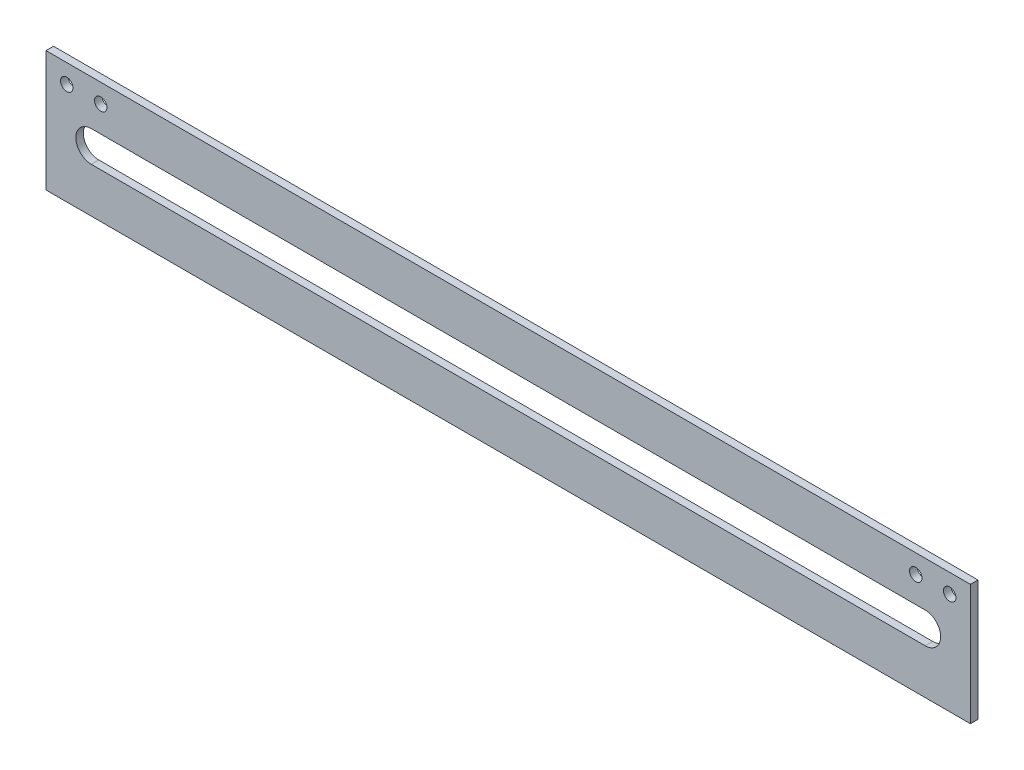
ISO-10303-21;
HEADER;
FILE_DESCRIPTION(('STEP AP214'),'2;1');
FILE_NAME('part.step','',(''),(''),'','','');
FILE_SCHEMA(('AUTOMOTIVE_DESIGN { 1 0 10303 214 1 1 1 1 }'));
ENDSEC;
DATA;
#1=APPLICATION_CONTEXT('core data for automotive mechanical design processes');
#2=APPLICATION_PROTOCOL_DEFINITION('international standard','automotive_design',2000,#1);
#3=PRODUCT_CONTEXT('',#1,'mechanical');
#4=PRODUCT('Part','Part','',(#3));
#5=PRODUCT_RELATED_PRODUCT_CATEGORY('part','',(#4));
#6=PRODUCT_DEFINITION_FORMATION('','',#4);
#7=PRODUCT_DEFINITION_CONTEXT('part definition',#1,'design');
#8=PRODUCT_DEFINITION('design','',#6,#7);
#9=PRODUCT_DEFINITION_SHAPE('','',#8);
#10=(LENGTH_UNIT() NAMED_UNIT(*) SI_UNIT(.MILLI.,.METRE.));
#11=(NAMED_UNIT(*) PLANE_ANGLE_UNIT() SI_UNIT($,.RADIAN.));
#12=(NAMED_UNIT(*) SI_UNIT($,.STERADIAN.) SOLID_ANGLE_UNIT());
#13=UNCERTAINTY_MEASURE_WITH_UNIT(LENGTH_MEASURE(1.E-05),#10,'distance_accuracy_value','');
#14=(GEOMETRIC_REPRESENTATION_CONTEXT(3) GLOBAL_UNCERTAINTY_ASSIGNED_CONTEXT((#13)) GLOBAL_UNIT_ASSIGNED_CONTEXT((#10,
#11,#12)) REPRESENTATION_CONTEXT('',''));
#15=CARTESIAN_POINT('',(0.,0.,0.));
#16=DIRECTION('',(0.,0.,1.));
#17=DIRECTION('',(1.,0.,0.));
#18=AXIS2_PLACEMENT_3D('',#15,#16,#17);
#19=CARTESIAN_POINT('',(0.,0.,2.));
#20=DIRECTION('',(0.,1.,0.));
#21=DIRECTION('',(-1.,0.,0.));
#22=AXIS2_PLACEMENT_3D('',#19,#20,#21);
#23=PLANE('',#22);
#24=DIRECTION('',(1.,0.,0.));
#25=VECTOR('',#24,1.);
#26=CARTESIAN_POINT('',(0.,0.,0.));
#27=LINE('',#26,#25);
#28=CARTESIAN_POINT('',(0.,0.,0.));
#29=VERTEX_POINT('',#28);
#30=CARTESIAN_POINT('',(245.,0.,0.));
#31=VERTEX_POINT('',#30);
#32=EDGE_CURVE('E157',#29,#31,#27,.T.);
#33=ORIENTED_EDGE('',*,*,#32,.T.);
#34=DIRECTION('',(0.,0.,-1.));
#35=VECTOR('',#34,1.);
#36=CARTESIAN_POINT('',(245.,0.,2.));
#37=LINE('',#36,#35);
#38=CARTESIAN_POINT('',(245.,0.,2.));
#39=VERTEX_POINT('',#38);
#40=EDGE_CURVE('E11',#39,#31,#37,.T.);
#41=ORIENTED_EDGE('',*,*,#40,.F.);
#42=DIRECTION('',(1.,0.,0.));
#43=VECTOR('',#42,1.);
#44=CARTESIAN_POINT('',(0.,0.,2.));
#45=LINE('',#44,#43);
#46=CARTESIAN_POINT('',(0.,0.,2.));
#47=VERTEX_POINT('',#46);
#48=EDGE_CURVE('E116',#47,#39,#45,.T.);
#49=ORIENTED_EDGE('',*,*,#48,.F.);
#50=DIRECTION('',(0.,0.,-1.));
#51=VECTOR('',#50,1.);
#52=CARTESIAN_POINT('',(0.,0.,2.));
#53=LINE('',#52,#51);
#54=EDGE_CURVE('E55',#47,#29,#53,.T.);
#55=ORIENTED_EDGE('',*,*,#54,.T.);
#56=EDGE_LOOP('',(#33,#41,#49,#55));
#57=FACE_BOUND('',#56,.T.);
#58=ADVANCED_FACE('F36',(#57),#23,.F.);
#59=CARTESIAN_POINT('',(245.,0.,2.));
#60=DIRECTION('',(-1.,0.,0.));
#61=DIRECTION('',(0.,0.,1.));
#62=AXIS2_PLACEMENT_3D('',#59,#60,#61);
#63=PLANE('',#62);
#64=DIRECTION('',(0.,1.,0.));
#65=VECTOR('',#64,1.);
#66=CARTESIAN_POINT('',(245.,0.,0.));
#67=LINE('',#66,#65);
#68=CARTESIAN_POINT('',(245.,32.,0.));
#69=VERTEX_POINT('',#68);
#70=EDGE_CURVE('E122',#31,#69,#67,.T.);
#71=ORIENTED_EDGE('',*,*,#70,.T.);
#72=DIRECTION('',(0.,0.,-1.));
#73=VECTOR('',#72,1.);
#74=CARTESIAN_POINT('',(245.,32.,2.));
#75=LINE('',#74,#73);
#76=CARTESIAN_POINT('',(245.,32.,2.));
#77=VERTEX_POINT('',#76);
#78=EDGE_CURVE('E46',#77,#69,#75,.T.);
#79=ORIENTED_EDGE('',*,*,#78,.F.);
#80=DIRECTION('',(0.,1.,0.));
#81=VECTOR('',#80,1.);
#82=CARTESIAN_POINT('',(245.,0.,2.));
#83=LINE('',#82,#81);
#84=EDGE_CURVE('E109',#39,#77,#83,.T.);
#85=ORIENTED_EDGE('',*,*,#84,.F.);
#86=ORIENTED_EDGE('',*,*,#40,.T.);
#87=EDGE_LOOP('',(#71,#79,#85,#86));
#88=FACE_BOUND('',#87,.T.);
#89=ADVANCED_FACE('F121',(#88),#63,.F.);
#90=CARTESIAN_POINT('',(0.,32.,2.));
#91=DIRECTION('',(0.,1.,0.));
#92=DIRECTION('',(0.,0.,1.));
#93=AXIS2_PLACEMENT_3D('',#90,#91,#92);
#94=PLANE('',#93);
#95=DIRECTION('',(1.,0.,0.));
#96=VECTOR('',#95,1.);
#97=CARTESIAN_POINT('',(0.,32.,0.));
#98=LINE('',#97,#96);
#99=CARTESIAN_POINT('',(0.,32.,0.));
#100=VERTEX_POINT('',#99);
#101=EDGE_CURVE('E160',#100,#69,#98,.T.);
#102=ORIENTED_EDGE('',*,*,#101,.F.);
#103=DIRECTION('',(0.,0.,-1.));
#104=VECTOR('',#103,1.);
#105=CARTESIAN_POINT('',(0.,32.,2.));
#106=LINE('',#105,#104);
#107=CARTESIAN_POINT('',(0.,32.,2.));
#108=VERTEX_POINT('',#107);
#109=EDGE_CURVE('E81',#108,#100,#106,.T.);
#110=ORIENTED_EDGE('',*,*,#109,.F.);
#111=DIRECTION('',(1.,0.,0.));
#112=VECTOR('',#111,1.);
#113=CARTESIAN_POINT('',(0.,32.,2.));
#114=LINE('',#113,#112);
#115=EDGE_CURVE('E115',#108,#77,#114,.T.);
#116=ORIENTED_EDGE('',*,*,#115,.T.);
#117=ORIENTED_EDGE('',*,*,#78,.T.);
#118=EDGE_LOOP('',(#102,#110,#116,#117));
#119=FACE_BOUND('',#118,.T.);
#120=ADVANCED_FACE('F126',(#119),#94,.T.);
#121=CARTESIAN_POINT('',(233.,16.,2.));
#122=DIRECTION('',(0.,0.,-1.));
#123=DIRECTION('',(-1.,0.,0.));
#124=AXIS2_PLACEMENT_3D('',#121,#122,#123);
#125=CYLINDRICAL_SURFACE('',#124,4.1);
#126=CARTESIAN_POINT('',(233.,16.,0.));
#127=DIRECTION('',(0.,0.,1.));
#128=DIRECTION('',(1.,0.,0.));
#129=AXIS2_PLACEMENT_3D('',#126,#127,#128);
#130=CIRCLE('',#129,4.1);
#131=CARTESIAN_POINT('',(233.,11.9,0.));
#132=VERTEX_POINT('',#131);
#133=CARTESIAN_POINT('',(233.,20.1,0.));
#134=VERTEX_POINT('',#133);
#135=EDGE_CURVE('E145',#132,#134,#130,.T.);
#136=ORIENTED_EDGE('',*,*,#135,.F.);
#137=DIRECTION('',(0.,0.,-1.));
#138=VECTOR('',#137,1.);
#139=CARTESIAN_POINT('',(233.,11.9,2.));
#140=LINE('',#139,#138);
#141=CARTESIAN_POINT('',(233.,11.9,2.));
#142=VERTEX_POINT('',#141);
#143=EDGE_CURVE('E40',#142,#132,#140,.T.);
#144=ORIENTED_EDGE('',*,*,#143,.F.);
#145=CARTESIAN_POINT('',(233.,16.,2.));
#146=DIRECTION('',(0.,0.,1.));
#147=DIRECTION('',(1.,0.,0.));
#148=AXIS2_PLACEMENT_3D('',#145,#146,#147);
#149=CIRCLE('',#148,4.1);
#150=CARTESIAN_POINT('',(233.,20.1,2.));
#151=VERTEX_POINT('',#150);
#152=EDGE_CURVE('E199',#142,#151,#149,.T.);
#153=ORIENTED_EDGE('',*,*,#152,.T.);
#154=DIRECTION('',(0.,0.,-1.));
#155=VECTOR('',#154,1.);
#156=CARTESIAN_POINT('',(233.,20.1,2.));
#157=LINE('',#156,#155);
#158=EDGE_CURVE('E135',#151,#134,#157,.T.);
#159=ORIENTED_EDGE('',*,*,#158,.T.);
#160=EDGE_LOOP('',(#136,#144,#153,#159));
#161=FACE_BOUND('',#160,.T.);
#162=ADVANCED_FACE('F183',(#161),#125,.F.);
#163=CARTESIAN_POINT('',(0.,11.9,2.));
#164=DIRECTION('',(0.,1.,0.));
#165=DIRECTION('',(0.,0.,1.));
#166=AXIS2_PLACEMENT_3D('',#163,#164,#165);
#167=PLANE('',#166);
#168=DIRECTION('',(1.,0.,0.));
#169=VECTOR('',#168,1.);
#170=CARTESIAN_POINT('',(0.,11.9,0.));
#171=LINE('',#170,#169);
#172=CARTESIAN_POINT('',(12.,11.9,0.));
#173=VERTEX_POINT('',#172);
#174=EDGE_CURVE('E148',#173,#132,#171,.T.);
#175=ORIENTED_EDGE('',*,*,#174,.F.);
#176=DIRECTION('',(0.,0.,-1.));
#177=VECTOR('',#176,1.);
#178=CARTESIAN_POINT('',(12.,11.9,2.));
#179=LINE('',#178,#177);
#180=CARTESIAN_POINT('',(12.,11.9,2.));
#181=VERTEX_POINT('',#180);
#182=EDGE_CURVE('E173',#181,#173,#179,.T.);
#183=ORIENTED_EDGE('',*,*,#182,.F.);
#184=DIRECTION('',(1.,0.,0.));
#185=VECTOR('',#184,1.);
#186=CARTESIAN_POINT('',(0.,11.9,2.));
#187=LINE('',#186,#185);
#188=EDGE_CURVE('E182',#181,#142,#187,.T.);
#189=ORIENTED_EDGE('',*,*,#188,.T.);
#190=ORIENTED_EDGE('',*,*,#143,.T.);
#191=EDGE_LOOP('',(#175,#183,#189,#190));
#192=FACE_BOUND('',#191,.T.);
#193=ADVANCED_FACE('F180',(#192),#167,.T.);
#194=CARTESIAN_POINT('',(12.,16.,2.));
#195=DIRECTION('',(0.,0.,-1.));
#196=DIRECTION('',(-1.,0.,0.));
#197=AXIS2_PLACEMENT_3D('',#194,#195,#196);
#198=CYLINDRICAL_SURFACE('',#197,4.1);
#199=CARTESIAN_POINT('',(12.,16.,0.));
#200=DIRECTION('',(0.,0.,1.));
#201=DIRECTION('',(1.,0.,0.));
#202=AXIS2_PLACEMENT_3D('',#199,#200,#201);
#203=CIRCLE('',#202,4.1);
#204=CARTESIAN_POINT('',(12.,20.1,0.));
#205=VERTEX_POINT('',#204);
#206=EDGE_CURVE('E151',#205,#173,#203,.T.);
#207=ORIENTED_EDGE('',*,*,#206,.F.);
#208=DIRECTION('',(0.,0.,-1.));
#209=VECTOR('',#208,1.);
#210=CARTESIAN_POINT('',(12.,20.1,2.));
#211=LINE('',#210,#209);
#212=CARTESIAN_POINT('',(12.,20.1,2.));
#213=VERTEX_POINT('',#212);
#214=EDGE_CURVE('E172',#213,#205,#211,.T.);
#215=ORIENTED_EDGE('',*,*,#214,.F.);
#216=CARTESIAN_POINT('',(12.,16.,2.));
#217=DIRECTION('',(0.,0.,1.));
#218=DIRECTION('',(1.,0.,0.));
#219=AXIS2_PLACEMENT_3D('',#216,#217,#218);
#220=CIRCLE('',#219,4.1);
#221=EDGE_CURVE('E192',#213,#181,#220,.T.);
#222=ORIENTED_EDGE('',*,*,#221,.T.);
#223=ORIENTED_EDGE('',*,*,#182,.T.);
#224=EDGE_LOOP('',(#207,#215,#222,#223));
#225=FACE_BOUND('',#224,.T.);
#226=ADVANCED_FACE('F189',(#225),#198,.F.);
#227=CARTESIAN_POINT('',(0.,0.,2.));
#228=DIRECTION('',(-1.,0.,0.));
#229=DIRECTION('',(0.,0.,1.));
#230=AXIS2_PLACEMENT_3D('',#227,#228,#229);
#231=PLANE('',#230);
#232=DIRECTION('',(0.,1.,0.));
#233=VECTOR('',#232,1.);
#234=CARTESIAN_POINT('',(0.,0.,0.));
#235=LINE('',#234,#233);
#236=EDGE_CURVE('E162',#29,#100,#235,.T.);
#237=ORIENTED_EDGE('',*,*,#236,.F.);
#238=ORIENTED_EDGE('',*,*,#54,.F.);
#239=DIRECTION('',(0.,1.,0.));
#240=VECTOR('',#239,1.);
#241=CARTESIAN_POINT('',(0.,0.,2.));
#242=LINE('',#241,#240);
#243=EDGE_CURVE('E127',#47,#108,#242,.T.);
#244=ORIENTED_EDGE('',*,*,#243,.T.);
#245=ORIENTED_EDGE('',*,*,#109,.T.);
#246=EDGE_LOOP('',(#237,#238,#244,#245));
#247=FACE_BOUND('',#246,.T.);
#248=ADVANCED_FACE('F236',(#247),#231,.T.);
#249=CARTESIAN_POINT('',(0.,20.1,2.));
#250=DIRECTION('',(0.,1.,0.));
#251=DIRECTION('',(0.,0.,1.));
#252=AXIS2_PLACEMENT_3D('',#249,#250,#251);
#253=PLANE('',#252);
#254=DIRECTION('',(1.,0.,0.));
#255=VECTOR('',#254,1.);
#256=CARTESIAN_POINT('',(0.,20.1,0.));
#257=LINE('',#256,#255);
#258=EDGE_CURVE('E154',#205,#134,#257,.T.);
#259=ORIENTED_EDGE('',*,*,#258,.T.);
#260=ORIENTED_EDGE('',*,*,#158,.F.);
#261=DIRECTION('',(1.,0.,0.));
#262=VECTOR('',#261,1.);
#263=CARTESIAN_POINT('',(0.,20.1,2.));
#264=LINE('',#263,#262);
#265=EDGE_CURVE('E194',#213,#151,#264,.T.);
#266=ORIENTED_EDGE('',*,*,#265,.F.);
#267=ORIENTED_EDGE('',*,*,#214,.T.);
#268=EDGE_LOOP('',(#259,#260,#266,#267));
#269=FACE_BOUND('',#268,.T.);
#270=ADVANCED_FACE('F195',(#269),#253,.F.);
#271=CARTESIAN_POINT('',(14.5,27.,2.));
#272=DIRECTION('',(0.,0.,-1.));
#273=DIRECTION('',(-1.,0.,0.));
#274=AXIS2_PLACEMENT_3D('',#271,#272,#273);
#275=CYLINDRICAL_SURFACE('',#274,1.65);
#276=CARTESIAN_POINT('',(14.5,27.,2.));
#277=DIRECTION('',(0.,0.,1.));
#278=DIRECTION('',(1.,0.,0.));
#279=AXIS2_PLACEMENT_3D('',#276,#277,#278);
#280=CIRCLE('',#279,1.65);
#281=CARTESIAN_POINT('',(16.15,27.,2.));
#282=VERTEX_POINT('',#281);
#283=EDGE_CURVE('E203',#282,#282,#280,.T.);
#284=ORIENTED_EDGE('',*,*,#283,.T.);
#285=EDGE_LOOP('',(#284));
#286=FACE_BOUND('',#285,.T.);
#287=CARTESIAN_POINT('',(14.5,27.,0.));
#288=DIRECTION('',(0.,0.,1.));
#289=DIRECTION('',(1.,0.,0.));
#290=AXIS2_PLACEMENT_3D('',#287,#288,#289);
#291=CIRCLE('',#290,1.65);
#292=CARTESIAN_POINT('',(16.15,27.,0.));
#293=VERTEX_POINT('',#292);
#294=EDGE_CURVE('E142',#293,#293,#291,.T.);
#295=ORIENTED_EDGE('',*,*,#294,.F.);
#296=EDGE_LOOP('',(#295));
#297=FACE_BOUND('',#296,.T.);
#298=ADVANCED_FACE('F227',(#286,#297),#275,.F.);
#299=CARTESIAN_POINT('',(5.5,27.,2.));
#300=DIRECTION('',(0.,0.,-1.));
#301=DIRECTION('',(-1.,0.,0.));
#302=AXIS2_PLACEMENT_3D('',#299,#300,#301);
#303=CYLINDRICAL_SURFACE('',#302,1.65);
#304=CARTESIAN_POINT('',(5.5,27.,2.));
#305=DIRECTION('',(0.,0.,1.));
#306=DIRECTION('',(1.,0.,0.));
#307=AXIS2_PLACEMENT_3D('',#304,#305,#306);
#308=CIRCLE('',#307,1.65);
#309=CARTESIAN_POINT('',(7.15,27.,2.));
#310=VERTEX_POINT('',#309);
#311=EDGE_CURVE('E206',#310,#310,#308,.T.);
#312=ORIENTED_EDGE('',*,*,#311,.T.);
#313=EDGE_LOOP('',(#312));
#314=FACE_BOUND('',#313,.T.);
#315=CARTESIAN_POINT('',(5.5,27.,0.));
#316=DIRECTION('',(0.,0.,1.));
#317=DIRECTION('',(1.,0.,0.));
#318=AXIS2_PLACEMENT_3D('',#315,#316,#317);
#319=CIRCLE('',#318,1.65);
#320=CARTESIAN_POINT('',(7.15,27.,0.));
#321=VERTEX_POINT('',#320);
#322=EDGE_CURVE('E139',#321,#321,#319,.T.);
#323=ORIENTED_EDGE('',*,*,#322,.F.);
#324=EDGE_LOOP('',(#323));
#325=FACE_BOUND('',#324,.T.);
#326=ADVANCED_FACE('F217',(#314,#325),#303,.F.);
#327=CARTESIAN_POINT('',(230.5,27.,2.));
#328=DIRECTION('',(0.,0.,-1.));
#329=DIRECTION('',(-1.,0.,0.));
#330=AXIS2_PLACEMENT_3D('',#327,#328,#329);
#331=CYLINDRICAL_SURFACE('',#330,1.65000000000002);
#332=CARTESIAN_POINT('',(230.5,27.,2.));
#333=DIRECTION('',(0.,0.,1.));
#334=DIRECTION('',(1.,0.,0.));
#335=AXIS2_PLACEMENT_3D('',#332,#333,#334);
#336=CIRCLE('',#335,1.65000000000002);
#337=CARTESIAN_POINT('',(232.15,27.,2.));
#338=VERTEX_POINT('',#337);
#339=EDGE_CURVE('E168',#338,#338,#336,.F.);
#340=ORIENTED_EDGE('',*,*,#339,.F.);
#341=EDGE_LOOP('',(#340));
#342=FACE_BOUND('',#341,.T.);
#343=CARTESIAN_POINT('',(230.5,27.,0.));
#344=DIRECTION('',(0.,0.,1.));
#345=DIRECTION('',(1.,0.,0.));
#346=AXIS2_PLACEMENT_3D('',#343,#344,#345);
#347=CIRCLE('',#346,1.65000000000002);
#348=CARTESIAN_POINT('',(232.15,27.,0.));
#349=VERTEX_POINT('',#348);
#350=EDGE_CURVE('E136',#349,#349,#347,.F.);
#351=ORIENTED_EDGE('',*,*,#350,.T.);
#352=EDGE_LOOP('',(#351));
#353=FACE_BOUND('',#352,.T.);
#354=ADVANCED_FACE('F38',(#342,#353),#331,.F.);
#355=CARTESIAN_POINT('',(239.5,27.,2.));
#356=DIRECTION('',(0.,0.,-1.));
#357=DIRECTION('',(-1.,0.,0.));
#358=AXIS2_PLACEMENT_3D('',#355,#356,#357);
#359=CYLINDRICAL_SURFACE('',#358,1.64999999999999);
#360=CARTESIAN_POINT('',(239.5,27.,2.));
#361=DIRECTION('',(0.,0.,1.));
#362=DIRECTION('',(1.,0.,0.));
#363=AXIS2_PLACEMENT_3D('',#360,#361,#362);
#364=CIRCLE('',#363,1.64999999999999);
#365=CARTESIAN_POINT('',(241.15,27.,2.));
#366=VERTEX_POINT('',#365);
#367=EDGE_CURVE('E129',#366,#366,#364,.F.);
#368=ORIENTED_EDGE('',*,*,#367,.F.);
#369=EDGE_LOOP('',(#368));
#370=FACE_BOUND('',#369,.T.);
#371=CARTESIAN_POINT('',(239.5,27.,0.));
#372=DIRECTION('',(0.,0.,1.));
#373=DIRECTION('',(1.,0.,0.));
#374=AXIS2_PLACEMENT_3D('',#371,#372,#373);
#375=CIRCLE('',#374,1.64999999999999);
#376=CARTESIAN_POINT('',(241.15,27.,0.));
#377=VERTEX_POINT('',#376);
#378=EDGE_CURVE('E165',#377,#377,#375,.F.);
#379=ORIENTED_EDGE('',*,*,#378,.T.);
#380=EDGE_LOOP('',(#379));
#381=FACE_BOUND('',#380,.T.);
#382=ADVANCED_FACE('F216',(#370,#381),#359,.F.);
#383=CARTESIAN_POINT('',(0.,0.,2.));
#384=DIRECTION('',(0.,0.,1.));
#385=DIRECTION('',(1.,0.,0.));
#386=AXIS2_PLACEMENT_3D('',#383,#384,#385);
#387=PLANE('',#386);
#388=ORIENTED_EDGE('',*,*,#339,.T.);
#389=EDGE_LOOP('',(#388));
#390=FACE_BOUND('',#389,.T.);
#391=ORIENTED_EDGE('',*,*,#311,.F.);
#392=EDGE_LOOP('',(#391));
#393=FACE_BOUND('',#392,.T.);
#394=ORIENTED_EDGE('',*,*,#283,.F.);
#395=EDGE_LOOP('',(#394));
#396=FACE_BOUND('',#395,.T.);
#397=ORIENTED_EDGE('',*,*,#152,.F.);
#398=ORIENTED_EDGE('',*,*,#188,.F.);
#399=ORIENTED_EDGE('',*,*,#221,.F.);
#400=ORIENTED_EDGE('',*,*,#265,.T.);
#401=EDGE_LOOP('',(#397,#398,#399,#400));
#402=FACE_BOUND('',#401,.T.);
#403=ORIENTED_EDGE('',*,*,#48,.T.);
#404=ORIENTED_EDGE('',*,*,#84,.T.);
#405=ORIENTED_EDGE('',*,*,#115,.F.);
#406=ORIENTED_EDGE('',*,*,#243,.F.);
#407=EDGE_LOOP('',(#403,#404,#405,#406));
#408=FACE_BOUND('',#407,.T.);
#409=ORIENTED_EDGE('',*,*,#367,.T.);
#410=EDGE_LOOP('',(#409));
#411=FACE_BOUND('',#410,.T.);
#412=ADVANCED_FACE('F111',(#390,#393,#396,#402,#408,#411),#387,.T.);
#413=CARTESIAN_POINT('',(0.,0.,0.));
#414=DIRECTION('',(0.,0.,1.));
#415=DIRECTION('',(1.,0.,0.));
#416=AXIS2_PLACEMENT_3D('',#413,#414,#415);
#417=PLANE('',#416);
#418=ORIENTED_EDGE('',*,*,#350,.F.);
#419=EDGE_LOOP('',(#418));
#420=FACE_BOUND('',#419,.T.);
#421=ORIENTED_EDGE('',*,*,#322,.T.);
#422=EDGE_LOOP('',(#421));
#423=FACE_BOUND('',#422,.T.);
#424=ORIENTED_EDGE('',*,*,#294,.T.);
#425=EDGE_LOOP('',(#424));
#426=FACE_BOUND('',#425,.T.);
#427=ORIENTED_EDGE('',*,*,#135,.T.);
#428=ORIENTED_EDGE('',*,*,#258,.F.);
#429=ORIENTED_EDGE('',*,*,#206,.T.);
#430=ORIENTED_EDGE('',*,*,#174,.T.);
#431=EDGE_LOOP('',(#427,#428,#429,#430));
#432=FACE_BOUND('',#431,.T.);
#433=ORIENTED_EDGE('',*,*,#32,.F.);
#434=ORIENTED_EDGE('',*,*,#236,.T.);
#435=ORIENTED_EDGE('',*,*,#101,.T.);
#436=ORIENTED_EDGE('',*,*,#70,.F.);
#437=EDGE_LOOP('',(#433,#434,#435,#436));
#438=FACE_BOUND('',#437,.T.);
#439=ORIENTED_EDGE('',*,*,#378,.F.);
#440=EDGE_LOOP('',(#439));
#441=FACE_BOUND('',#440,.T.);
#442=ADVANCED_FACE('F187',(#420,#423,#426,#432,#438,#441),#417,.F.);
#443=CLOSED_SHELL('',(#58,#89,#120,#162,#193,#226,#248,#270,#298,#326,#354,#382,#412,#442));
#444=MANIFOLD_SOLID_BREP('B2',#443);
#445=ADVANCED_BREP_SHAPE_REPRESENTATION('',(#18,#444),#14);
#446=SHAPE_DEFINITION_REPRESENTATION(#9,#445);
ENDSEC;
END-ISO-10303-21;
